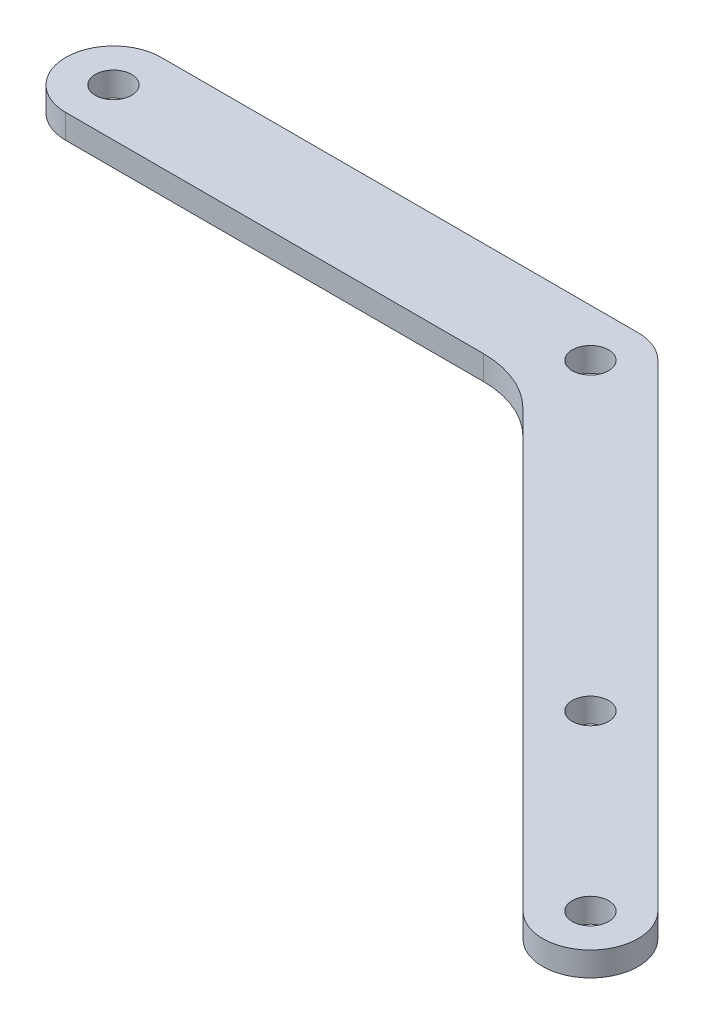
ISO-10303-21;
HEADER;
FILE_DESCRIPTION(('STEP AP214'),'2;1');
FILE_NAME('part.step','',(''),(''),'','','');
FILE_SCHEMA(('AUTOMOTIVE_DESIGN { 1 0 10303 214 1 1 1 1 }'));
ENDSEC;
DATA;
#1=APPLICATION_CONTEXT('core data for automotive mechanical design processes');
#2=APPLICATION_PROTOCOL_DEFINITION('international standard','automotive_design',2000,#1);
#3=PRODUCT_CONTEXT('',#1,'mechanical');
#4=PRODUCT('Part','Part','',(#3));
#5=PRODUCT_RELATED_PRODUCT_CATEGORY('part','',(#4));
#6=PRODUCT_DEFINITION_FORMATION('','',#4);
#7=PRODUCT_DEFINITION_CONTEXT('part definition',#1,'design');
#8=PRODUCT_DEFINITION('design','',#6,#7);
#9=PRODUCT_DEFINITION_SHAPE('','',#8);
#10=(LENGTH_UNIT() NAMED_UNIT(*) SI_UNIT(.MILLI.,.METRE.));
#11=(NAMED_UNIT(*) PLANE_ANGLE_UNIT() SI_UNIT($,.RADIAN.));
#12=(NAMED_UNIT(*) SI_UNIT($,.STERADIAN.) SOLID_ANGLE_UNIT());
#13=UNCERTAINTY_MEASURE_WITH_UNIT(LENGTH_MEASURE(1.E-05),#10,'distance_accuracy_value','');
#14=(GEOMETRIC_REPRESENTATION_CONTEXT(3) GLOBAL_UNCERTAINTY_ASSIGNED_CONTEXT((#13)) GLOBAL_UNIT_ASSIGNED_CONTEXT((#10,
#11,#12)) REPRESENTATION_CONTEXT('',''));
#15=CARTESIAN_POINT('',(0.,0.,0.));
#16=DIRECTION('',(0.,0.,1.));
#17=DIRECTION('',(1.,0.,0.));
#18=AXIS2_PLACEMENT_3D('',#15,#16,#17);
#19=CARTESIAN_POINT('',(8.83883476483184,3.175,-8.83883476483184));
#20=DIRECTION('',(0.707106781186548,0.,-0.707106781186548));
#21=DIRECTION('',(-0.707106781186548,0.,-0.707106781186548));
#22=AXIS2_PLACEMENT_3D('',#19,#20,#21);
#23=PLANE('',#22);
#24=DIRECTION('',(0.707106781186548,0.,0.707106781186548));
#25=VECTOR('',#24,1.);
#26=CARTESIAN_POINT('',(8.83883476483184,-3.175,-8.83883476483184));
#27=LINE('',#26,#25);
#28=CARTESIAN_POINT('',(8.83883476483184,-3.175,-8.83883476483184));
#29=VERTEX_POINT('',#28);
#30=CARTESIAN_POINT('',(133.838834764832,-3.175,116.161165235168));
#31=VERTEX_POINT('',#30);
#32=EDGE_CURVE('E114',#29,#31,#27,.T.);
#33=ORIENTED_EDGE('',*,*,#32,.F.);
#34=DIRECTION('',(0.,-1.,0.));
#35=VECTOR('',#34,1.);
#36=CARTESIAN_POINT('',(8.83883476483184,3.175,-8.83883476483184));
#37=LINE('',#36,#35);
#38=CARTESIAN_POINT('',(8.83883476483184,3.175,-8.83883476483184));
#39=VERTEX_POINT('',#38);
#40=EDGE_CURVE('E109',#39,#29,#37,.T.);
#41=ORIENTED_EDGE('',*,*,#40,.F.);
#42=DIRECTION('',(0.707106781186548,0.,0.707106781186548));
#43=VECTOR('',#42,1.);
#44=CARTESIAN_POINT('',(8.83883476483184,3.175,-8.83883476483184));
#45=LINE('',#44,#43);
#46=CARTESIAN_POINT('',(133.838834764832,3.175,116.161165235168));
#47=VERTEX_POINT('',#46);
#48=EDGE_CURVE('E112',#39,#47,#45,.T.);
#49=ORIENTED_EDGE('',*,*,#48,.T.);
#50=DIRECTION('',(0.,-1.,0.));
#51=VECTOR('',#50,1.);
#52=CARTESIAN_POINT('',(133.838834764832,3.175,116.161165235168));
#53=LINE('',#52,#51);
#54=EDGE_CURVE('E173',#47,#31,#53,.T.);
#55=ORIENTED_EDGE('',*,*,#54,.T.);
#56=EDGE_LOOP('',(#33,#41,#49,#55));
#57=FACE_BOUND('',#56,.T.);
#58=ADVANCED_FACE('F45',(#57),#23,.T.);
#59=CARTESIAN_POINT('',(0.,3.175,0.));
#60=DIRECTION('',(0.,-1.,0.));
#61=DIRECTION('',(0.,0.,-1.));
#62=AXIS2_PLACEMENT_3D('',#59,#60,#61);
#63=CYLINDRICAL_SURFACE('',#62,12.5);
#64=CARTESIAN_POINT('',(0.,-3.175,0.));
#65=DIRECTION('',(0.,1.,0.));
#66=DIRECTION('',(0.,0.,1.));
#67=AXIS2_PLACEMENT_3D('',#64,#65,#66);
#68=CIRCLE('',#67,12.5);
#69=CARTESIAN_POINT('',(0.,-3.175,-12.5));
#70=VERTEX_POINT('',#69);
#71=EDGE_CURVE('E176',#29,#70,#68,.T.);
#72=ORIENTED_EDGE('',*,*,#71,.T.);
#73=DIRECTION('',(0.,-1.,0.));
#74=VECTOR('',#73,1.);
#75=CARTESIAN_POINT('',(0.,3.175,-12.5));
#76=LINE('',#75,#74);
#77=CARTESIAN_POINT('',(0.,3.175,-12.5));
#78=VERTEX_POINT('',#77);
#79=EDGE_CURVE('E119',#78,#70,#76,.T.);
#80=ORIENTED_EDGE('',*,*,#79,.F.);
#81=CARTESIAN_POINT('',(0.,3.175,0.));
#82=DIRECTION('',(0.,1.,0.));
#83=DIRECTION('',(0.,0.,1.));
#84=AXIS2_PLACEMENT_3D('',#81,#82,#83);
#85=CIRCLE('',#84,12.5);
#86=EDGE_CURVE('E122',#39,#78,#85,.T.);
#87=ORIENTED_EDGE('',*,*,#86,.F.);
#88=ORIENTED_EDGE('',*,*,#40,.T.);
#89=EDGE_LOOP('',(#72,#80,#87,#88));
#90=FACE_BOUND('',#89,.T.);
#91=ADVANCED_FACE('F123',(#90),#63,.T.);
#92=CARTESIAN_POINT('',(0.,3.175,-12.5));
#93=DIRECTION('',(0.,0.,1.));
#94=DIRECTION('',(1.,0.,0.));
#95=AXIS2_PLACEMENT_3D('',#92,#93,#94);
#96=PLANE('',#95);
#97=DIRECTION('',(-1.,0.,0.));
#98=VECTOR('',#97,1.);
#99=CARTESIAN_POINT('',(0.,-3.175,-12.5));
#100=LINE('',#99,#98);
#101=CARTESIAN_POINT('',(-125.,-3.175,-12.5));
#102=VERTEX_POINT('',#101);
#103=EDGE_CURVE('E179',#70,#102,#100,.T.);
#104=ORIENTED_EDGE('',*,*,#103,.T.);
#105=DIRECTION('',(0.,-1.,0.));
#106=VECTOR('',#105,1.);
#107=CARTESIAN_POINT('',(-125.,3.175,-12.5));
#108=LINE('',#107,#106);
#109=CARTESIAN_POINT('',(-125.,3.175,-12.5));
#110=VERTEX_POINT('',#109);
#111=EDGE_CURVE('E217',#110,#102,#108,.T.);
#112=ORIENTED_EDGE('',*,*,#111,.F.);
#113=DIRECTION('',(-1.,0.,0.));
#114=VECTOR('',#113,1.);
#115=CARTESIAN_POINT('',(0.,3.175,-12.5));
#116=LINE('',#115,#114);
#117=EDGE_CURVE('E128',#78,#110,#116,.T.);
#118=ORIENTED_EDGE('',*,*,#117,.F.);
#119=ORIENTED_EDGE('',*,*,#79,.T.);
#120=EDGE_LOOP('',(#104,#112,#118,#119));
#121=FACE_BOUND('',#120,.T.);
#122=ADVANCED_FACE('F258',(#121),#96,.F.);
#123=CARTESIAN_POINT('',(-125.,3.175,0.));
#124=DIRECTION('',(0.,-1.,0.));
#125=DIRECTION('',(0.,0.,-1.));
#126=AXIS2_PLACEMENT_3D('',#123,#124,#125);
#127=CYLINDRICAL_SURFACE('',#126,12.5);
#128=CARTESIAN_POINT('',(-125.,-3.175,0.));
#129=DIRECTION('',(0.,1.,0.));
#130=DIRECTION('',(0.,0.,1.));
#131=AXIS2_PLACEMENT_3D('',#128,#129,#130);
#132=CIRCLE('',#131,12.5);
#133=CARTESIAN_POINT('',(-125.,-3.175,12.5));
#134=VERTEX_POINT('',#133);
#135=EDGE_CURVE('E182',#102,#134,#132,.T.);
#136=ORIENTED_EDGE('',*,*,#135,.T.);
#137=DIRECTION('',(0.,-1.,0.));
#138=VECTOR('',#137,1.);
#139=CARTESIAN_POINT('',(-125.,3.175,12.5));
#140=LINE('',#139,#138);
#141=CARTESIAN_POINT('',(-125.,3.175,12.5));
#142=VERTEX_POINT('',#141);
#143=EDGE_CURVE('E213',#142,#134,#140,.T.);
#144=ORIENTED_EDGE('',*,*,#143,.F.);
#145=CARTESIAN_POINT('',(-125.,3.175,0.));
#146=DIRECTION('',(0.,1.,0.));
#147=DIRECTION('',(0.,0.,1.));
#148=AXIS2_PLACEMENT_3D('',#145,#146,#147);
#149=CIRCLE('',#148,12.5);
#150=EDGE_CURVE('E145',#110,#142,#149,.T.);
#151=ORIENTED_EDGE('',*,*,#150,.F.);
#152=ORIENTED_EDGE('',*,*,#111,.T.);
#153=EDGE_LOOP('',(#136,#144,#151,#152));
#154=FACE_BOUND('',#153,.T.);
#155=ADVANCED_FACE('F263',(#154),#127,.T.);
#156=CARTESIAN_POINT('',(0.,3.175,12.5));
#157=DIRECTION('',(0.,0.,1.));
#158=DIRECTION('',(1.,0.,0.));
#159=AXIS2_PLACEMENT_3D('',#156,#157,#158);
#160=PLANE('',#159);
#161=DIRECTION('',(-1.,0.,0.));
#162=VECTOR('',#161,1.);
#163=CARTESIAN_POINT('',(0.,-3.175,12.5));
#164=LINE('',#163,#162);
#165=CARTESIAN_POINT('',(-15.5330085889911,-3.175,12.5));
#166=VERTEX_POINT('',#165);
#167=EDGE_CURVE('E186',#166,#134,#164,.T.);
#168=ORIENTED_EDGE('',*,*,#167,.F.);
#169=DIRECTION('',(0.,-1.,0.));
#170=VECTOR('',#169,1.);
#171=CARTESIAN_POINT('',(-15.5330085889911,3.175,12.5));
#172=LINE('',#171,#170);
#173=CARTESIAN_POINT('',(-15.5330085889911,3.175,12.5));
#174=VERTEX_POINT('',#173);
#175=EDGE_CURVE('E61',#166,#174,#172,.F.);
#176=ORIENTED_EDGE('',*,*,#175,.T.);
#177=DIRECTION('',(-1.,0.,0.));
#178=VECTOR('',#177,1.);
#179=CARTESIAN_POINT('',(0.,3.175,12.5));
#180=LINE('',#179,#178);
#181=EDGE_CURVE('E149',#174,#142,#180,.T.);
#182=ORIENTED_EDGE('',*,*,#181,.T.);
#183=ORIENTED_EDGE('',*,*,#143,.T.);
#184=EDGE_LOOP('',(#168,#176,#182,#183));
#185=FACE_BOUND('',#184,.T.);
#186=ADVANCED_FACE('F267',(#185),#160,.T.);
#187=CARTESIAN_POINT('',(-8.83883476483184,3.175,8.83883476483184));
#188=DIRECTION('',(0.707106781186548,0.,-0.707106781186548));
#189=DIRECTION('',(-0.707106781186548,0.,-0.707106781186548));
#190=AXIS2_PLACEMENT_3D('',#187,#188,#189);
#191=PLANE('',#190);
#192=DIRECTION('',(0.707106781186548,0.,0.707106781186548));
#193=VECTOR('',#192,1.);
#194=CARTESIAN_POINT('',(-8.83883476483184,3.175,8.83883476483184));
#195=LINE('',#194,#193);
#196=CARTESIAN_POINT('',(2.14466094067264,3.175,19.8223304703363));
#197=VERTEX_POINT('',#196);
#198=CARTESIAN_POINT('',(116.161165235168,3.175,133.838834764832));
#199=VERTEX_POINT('',#198);
#200=EDGE_CURVE('E152',#197,#199,#195,.T.);
#201=ORIENTED_EDGE('',*,*,#200,.F.);
#202=DIRECTION('',(0.,-1.,0.));
#203=VECTOR('',#202,1.);
#204=CARTESIAN_POINT('',(2.14466094067264,3.175,19.8223304703363));
#205=LINE('',#204,#203);
#206=CARTESIAN_POINT('',(2.14466094067264,-3.175,19.8223304703363));
#207=VERTEX_POINT('',#206);
#208=EDGE_CURVE('E118',#197,#207,#205,.T.);
#209=ORIENTED_EDGE('',*,*,#208,.T.);
#210=DIRECTION('',(0.707106781186548,0.,0.707106781186548));
#211=VECTOR('',#210,1.);
#212=CARTESIAN_POINT('',(-8.83883476483184,-3.175,8.83883476483184));
#213=LINE('',#212,#211);
#214=CARTESIAN_POINT('',(116.161165235168,-3.175,133.838834764832));
#215=VERTEX_POINT('',#214);
#216=EDGE_CURVE('E189',#207,#215,#213,.T.);
#217=ORIENTED_EDGE('',*,*,#216,.T.);
#218=DIRECTION('',(0.,-1.,0.));
#219=VECTOR('',#218,1.);
#220=CARTESIAN_POINT('',(116.161165235168,3.175,133.838834764832));
#221=LINE('',#220,#219);
#222=EDGE_CURVE('E209',#199,#215,#221,.T.);
#223=ORIENTED_EDGE('',*,*,#222,.F.);
#224=EDGE_LOOP('',(#201,#209,#217,#223));
#225=FACE_BOUND('',#224,.T.);
#226=ADVANCED_FACE('F231',(#225),#191,.F.);
#227=CARTESIAN_POINT('',(79.5830297449148,3.175,79.5830297449148));
#228=DIRECTION('',(0.,-1.,0.));
#229=DIRECTION('',(0.,0.,-1.));
#230=AXIS2_PLACEMENT_3D('',#227,#228,#229);
#231=CYLINDRICAL_SURFACE('',#230,4.7625);
#232=CARTESIAN_POINT('',(79.5830297449148,3.175,79.5830297449148));
#233=DIRECTION('',(0.,1.,0.));
#234=DIRECTION('',(0.,0.,1.));
#235=AXIS2_PLACEMENT_3D('',#232,#233,#234);
#236=CIRCLE('',#235,4.7625);
#237=CARTESIAN_POINT('',(79.5830297449148,3.175,84.3455297449148));
#238=VERTEX_POINT('',#237);
#239=EDGE_CURVE('E165',#238,#238,#236,.T.);
#240=ORIENTED_EDGE('',*,*,#239,.T.);
#241=EDGE_LOOP('',(#240));
#242=FACE_BOUND('',#241,.T.);
#243=CARTESIAN_POINT('',(79.5830297449148,-3.175,79.5830297449148));
#244=DIRECTION('',(0.,1.,0.));
#245=DIRECTION('',(0.,0.,1.));
#246=AXIS2_PLACEMENT_3D('',#243,#244,#245);
#247=CIRCLE('',#246,4.7625);
#248=CARTESIAN_POINT('',(79.5830297449148,-3.175,84.3455297449148));
#249=VERTEX_POINT('',#248);
#250=EDGE_CURVE('E140',#249,#249,#247,.T.);
#251=ORIENTED_EDGE('',*,*,#250,.F.);
#252=EDGE_LOOP('',(#251));
#253=FACE_BOUND('',#252,.T.);
#254=ADVANCED_FACE('F271',(#242,#253),#231,.F.);
#255=CARTESIAN_POINT('',(0.,3.175,0.));
#256=DIRECTION('',(0.,-1.,0.));
#257=DIRECTION('',(0.,0.,-1.));
#258=AXIS2_PLACEMENT_3D('',#255,#256,#257);
#259=CYLINDRICAL_SURFACE('',#258,4.7625);
#260=CARTESIAN_POINT('',(0.,3.175,0.));
#261=DIRECTION('',(0.,1.,0.));
#262=DIRECTION('',(0.,0.,1.));
#263=AXIS2_PLACEMENT_3D('',#260,#261,#262);
#264=CIRCLE('',#263,4.7625);
#265=CARTESIAN_POINT('',(0.,3.175,4.7625));
#266=VERTEX_POINT('',#265);
#267=EDGE_CURVE('E161',#266,#266,#264,.T.);
#268=ORIENTED_EDGE('',*,*,#267,.T.);
#269=EDGE_LOOP('',(#268));
#270=FACE_BOUND('',#269,.T.);
#271=CARTESIAN_POINT('',(0.,-3.175,0.));
#272=DIRECTION('',(0.,1.,0.));
#273=DIRECTION('',(0.,0.,1.));
#274=AXIS2_PLACEMENT_3D('',#271,#272,#273);
#275=CIRCLE('',#274,4.7625);
#276=CARTESIAN_POINT('',(0.,-3.175,4.7625));
#277=VERTEX_POINT('',#276);
#278=EDGE_CURVE('E200',#277,#277,#275,.T.);
#279=ORIENTED_EDGE('',*,*,#278,.F.);
#280=EDGE_LOOP('',(#279));
#281=FACE_BOUND('',#280,.T.);
#282=ADVANCED_FACE('F250',(#270,#281),#259,.F.);
#283=CARTESIAN_POINT('',(-125.,3.175,0.));
#284=DIRECTION('',(0.,-1.,0.));
#285=DIRECTION('',(0.,0.,-1.));
#286=AXIS2_PLACEMENT_3D('',#283,#284,#285);
#287=CYLINDRICAL_SURFACE('',#286,4.7625);
#288=CARTESIAN_POINT('',(-125.,3.175,0.));
#289=DIRECTION('',(0.,1.,0.));
#290=DIRECTION('',(0.,0.,1.));
#291=AXIS2_PLACEMENT_3D('',#288,#289,#290);
#292=CIRCLE('',#291,4.7625);
#293=CARTESIAN_POINT('',(-125.,3.175,4.7625));
#294=VERTEX_POINT('',#293);
#295=EDGE_CURVE('E157',#294,#294,#292,.T.);
#296=ORIENTED_EDGE('',*,*,#295,.T.);
#297=EDGE_LOOP('',(#296));
#298=FACE_BOUND('',#297,.T.);
#299=CARTESIAN_POINT('',(-125.,-3.175,0.));
#300=DIRECTION('',(0.,1.,0.));
#301=DIRECTION('',(0.,0.,1.));
#302=AXIS2_PLACEMENT_3D('',#299,#300,#301);
#303=CIRCLE('',#302,4.7625);
#304=CARTESIAN_POINT('',(-125.,-3.175,4.7625));
#305=VERTEX_POINT('',#304);
#306=EDGE_CURVE('E196',#305,#305,#303,.T.);
#307=ORIENTED_EDGE('',*,*,#306,.F.);
#308=EDGE_LOOP('',(#307));
#309=FACE_BOUND('',#308,.T.);
#310=ADVANCED_FACE('F242',(#298,#309),#287,.F.);
#311=CARTESIAN_POINT('',(125.,3.175,125.));
#312=DIRECTION('',(0.,-1.,0.));
#313=DIRECTION('',(0.,0.,-1.));
#314=AXIS2_PLACEMENT_3D('',#311,#312,#313);
#315=CYLINDRICAL_SURFACE('',#314,12.5);
#316=CARTESIAN_POINT('',(125.,-3.175,125.));
#317=DIRECTION('',(0.,1.,0.));
#318=DIRECTION('',(0.,0.,1.));
#319=AXIS2_PLACEMENT_3D('',#316,#317,#318);
#320=CIRCLE('',#319,12.5);
#321=EDGE_CURVE('E192',#215,#31,#320,.T.);
#322=ORIENTED_EDGE('',*,*,#321,.T.);
#323=ORIENTED_EDGE('',*,*,#54,.F.);
#324=CARTESIAN_POINT('',(125.,3.175,125.));
#325=DIRECTION('',(0.,1.,0.));
#326=DIRECTION('',(0.,0.,1.));
#327=AXIS2_PLACEMENT_3D('',#324,#325,#326);
#328=CIRCLE('',#327,12.5);
#329=EDGE_CURVE('E133',#199,#47,#328,.T.);
#330=ORIENTED_EDGE('',*,*,#329,.F.);
#331=ORIENTED_EDGE('',*,*,#222,.T.);
#332=EDGE_LOOP('',(#322,#323,#330,#331));
#333=FACE_BOUND('',#332,.T.);
#334=ADVANCED_FACE('F239',(#333),#315,.T.);
#335=CARTESIAN_POINT('',(125.,3.175,125.));
#336=DIRECTION('',(0.,-1.,0.));
#337=DIRECTION('',(0.,0.,-1.));
#338=AXIS2_PLACEMENT_3D('',#335,#336,#337);
#339=CYLINDRICAL_SURFACE('',#338,4.76250000000001);
#340=CARTESIAN_POINT('',(125.,3.175,125.));
#341=DIRECTION('',(0.,1.,0.));
#342=DIRECTION('',(0.,0.,1.));
#343=AXIS2_PLACEMENT_3D('',#340,#341,#342);
#344=CIRCLE('',#343,4.76250000000001);
#345=CARTESIAN_POINT('',(125.,3.175,129.7625));
#346=VERTEX_POINT('',#345);
#347=EDGE_CURVE('E169',#346,#346,#344,.T.);
#348=ORIENTED_EDGE('',*,*,#347,.T.);
#349=EDGE_LOOP('',(#348));
#350=FACE_BOUND('',#349,.T.);
#351=CARTESIAN_POINT('',(125.,-3.175,125.));
#352=DIRECTION('',(0.,1.,0.));
#353=DIRECTION('',(0.,0.,1.));
#354=AXIS2_PLACEMENT_3D('',#351,#352,#353);
#355=CIRCLE('',#354,4.76250000000001);
#356=CARTESIAN_POINT('',(125.,-3.175,129.7625));
#357=VERTEX_POINT('',#356);
#358=EDGE_CURVE('E136',#357,#357,#355,.T.);
#359=ORIENTED_EDGE('',*,*,#358,.F.);
#360=EDGE_LOOP('',(#359));
#361=FACE_BOUND('',#360,.T.);
#362=ADVANCED_FACE('F241',(#350,#361),#339,.F.);
#363=CARTESIAN_POINT('',(0.,3.175,0.));
#364=DIRECTION('',(0.,1.,0.));
#365=DIRECTION('',(0.,0.,1.));
#366=AXIS2_PLACEMENT_3D('',#363,#364,#365);
#367=PLANE('',#366);
#368=ORIENTED_EDGE('',*,*,#48,.F.);
#369=ORIENTED_EDGE('',*,*,#86,.T.);
#370=ORIENTED_EDGE('',*,*,#117,.T.);
#371=ORIENTED_EDGE('',*,*,#150,.T.);
#372=ORIENTED_EDGE('',*,*,#181,.F.);
#373=CARTESIAN_POINT('',(-15.5330085889911,3.175,37.5));
#374=DIRECTION('',(0.,1.,0.));
#375=DIRECTION('',(0.,0.,1.));
#376=AXIS2_PLACEMENT_3D('',#373,#374,#375);
#377=CIRCLE('',#376,25.);
#378=EDGE_CURVE('E11',#174,#197,#377,.F.);
#379=ORIENTED_EDGE('',*,*,#378,.T.);
#380=ORIENTED_EDGE('',*,*,#200,.T.);
#381=ORIENTED_EDGE('',*,*,#329,.T.);
#382=EDGE_LOOP('',(#368,#369,#370,#371,#372,#379,#380,#381));
#383=FACE_BOUND('',#382,.T.);
#384=ORIENTED_EDGE('',*,*,#295,.F.);
#385=EDGE_LOOP('',(#384));
#386=FACE_BOUND('',#385,.T.);
#387=ORIENTED_EDGE('',*,*,#267,.F.);
#388=EDGE_LOOP('',(#387));
#389=FACE_BOUND('',#388,.T.);
#390=ORIENTED_EDGE('',*,*,#239,.F.);
#391=EDGE_LOOP('',(#390));
#392=FACE_BOUND('',#391,.T.);
#393=ORIENTED_EDGE('',*,*,#347,.F.);
#394=EDGE_LOOP('',(#393));
#395=FACE_BOUND('',#394,.T.);
#396=ADVANCED_FACE('F130',(#383,#386,#389,#392,#395),#367,.T.);
#397=CARTESIAN_POINT('',(0.,-3.175,0.));
#398=DIRECTION('',(0.,1.,0.));
#399=DIRECTION('',(0.,0.,1.));
#400=AXIS2_PLACEMENT_3D('',#397,#398,#399);
#401=PLANE('',#400);
#402=ORIENTED_EDGE('',*,*,#32,.T.);
#403=ORIENTED_EDGE('',*,*,#321,.F.);
#404=ORIENTED_EDGE('',*,*,#216,.F.);
#405=CARTESIAN_POINT('',(-15.5330085889911,-3.175,37.5));
#406=DIRECTION('',(0.,1.,0.));
#407=DIRECTION('',(0.,0.,1.));
#408=AXIS2_PLACEMENT_3D('',#405,#406,#407);
#409=CIRCLE('',#408,25.);
#410=EDGE_CURVE('E54',#207,#166,#409,.T.);
#411=ORIENTED_EDGE('',*,*,#410,.T.);
#412=ORIENTED_EDGE('',*,*,#167,.T.);
#413=ORIENTED_EDGE('',*,*,#135,.F.);
#414=ORIENTED_EDGE('',*,*,#103,.F.);
#415=ORIENTED_EDGE('',*,*,#71,.F.);
#416=EDGE_LOOP('',(#402,#403,#404,#411,#412,#413,#414,#415));
#417=FACE_BOUND('',#416,.T.);
#418=ORIENTED_EDGE('',*,*,#306,.T.);
#419=EDGE_LOOP('',(#418));
#420=FACE_BOUND('',#419,.T.);
#421=ORIENTED_EDGE('',*,*,#278,.T.);
#422=EDGE_LOOP('',(#421));
#423=FACE_BOUND('',#422,.T.);
#424=ORIENTED_EDGE('',*,*,#250,.T.);
#425=EDGE_LOOP('',(#424));
#426=FACE_BOUND('',#425,.T.);
#427=ORIENTED_EDGE('',*,*,#358,.T.);
#428=EDGE_LOOP('',(#427));
#429=FACE_BOUND('',#428,.T.);
#430=ADVANCED_FACE('F236',(#417,#420,#423,#426,#429),#401,.F.);
#431=CARTESIAN_POINT('',(-15.5330085889911,3.175,37.5));
#432=DIRECTION('',(0.,-1.,0.));
#433=DIRECTION('',(0.,0.,-1.));
#434=AXIS2_PLACEMENT_3D('',#431,#432,#433);
#435=CYLINDRICAL_SURFACE('',#434,25.);
#436=ORIENTED_EDGE('',*,*,#378,.F.);
#437=ORIENTED_EDGE('',*,*,#175,.F.);
#438=ORIENTED_EDGE('',*,*,#410,.F.);
#439=ORIENTED_EDGE('',*,*,#208,.F.);
#440=EDGE_LOOP('',(#436,#437,#438,#439));
#441=FACE_BOUND('',#440,.T.);
#442=ADVANCED_FACE('F47',(#441),#435,.F.);
#443=CLOSED_SHELL('',(#58,#91,#122,#155,#186,#226,#254,#282,#310,#334,#362,#396,#430,#442));
#444=MANIFOLD_SOLID_BREP('B2',#443);
#445=ADVANCED_BREP_SHAPE_REPRESENTATION('',(#18,#444),#14);
#446=SHAPE_DEFINITION_REPRESENTATION(#9,#445);
ENDSEC;
END-ISO-10303-21;
